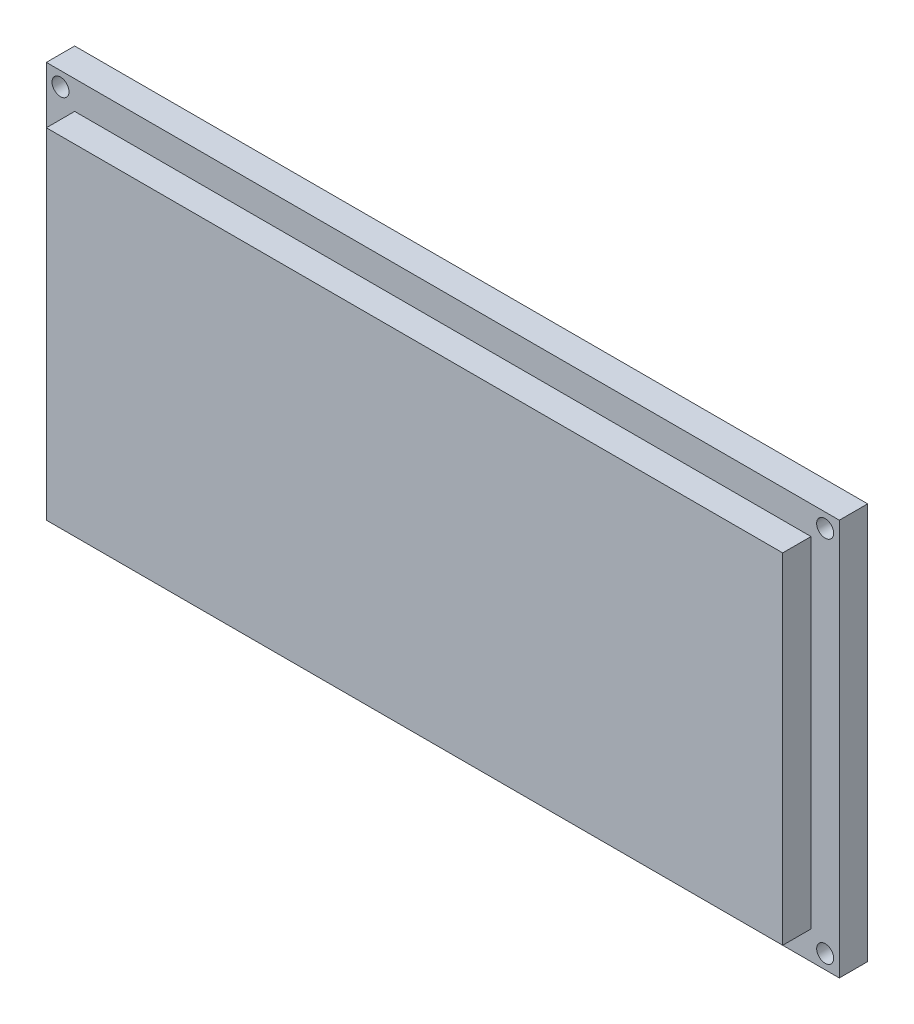
ISO-10303-21;
HEADER;
FILE_DESCRIPTION(('STEP AP214'),'2;1');
FILE_NAME('part.step','',(''),(''),'','','');
FILE_SCHEMA(('AUTOMOTIVE_DESIGN { 1 0 10303 214 1 1 1 1 }'));
ENDSEC;
DATA;
#1=APPLICATION_CONTEXT('core data for automotive mechanical design processes');
#2=APPLICATION_PROTOCOL_DEFINITION('international standard','automotive_design',2000,#1);
#3=PRODUCT_CONTEXT('',#1,'mechanical');
#4=PRODUCT('Part','Part','',(#3));
#5=PRODUCT_RELATED_PRODUCT_CATEGORY('part','',(#4));
#6=PRODUCT_DEFINITION_FORMATION('','',#4);
#7=PRODUCT_DEFINITION_CONTEXT('part definition',#1,'design');
#8=PRODUCT_DEFINITION('design','',#6,#7);
#9=PRODUCT_DEFINITION_SHAPE('','',#8);
#10=(LENGTH_UNIT() NAMED_UNIT(*) SI_UNIT(.MILLI.,.METRE.));
#11=(NAMED_UNIT(*) PLANE_ANGLE_UNIT() SI_UNIT($,.RADIAN.));
#12=(NAMED_UNIT(*) SI_UNIT($,.STERADIAN.) SOLID_ANGLE_UNIT());
#13=UNCERTAINTY_MEASURE_WITH_UNIT(LENGTH_MEASURE(1.E-05),#10,'distance_accuracy_value','');
#14=(GEOMETRIC_REPRESENTATION_CONTEXT(3) GLOBAL_UNCERTAINTY_ASSIGNED_CONTEXT((#13)) GLOBAL_UNIT_ASSIGNED_CONTEXT((#10,
#11,#12)) REPRESENTATION_CONTEXT('',''));
#15=CARTESIAN_POINT('',(0.,0.,0.));
#16=DIRECTION('',(0.,0.,1.));
#17=DIRECTION('',(1.,0.,0.));
#18=AXIS2_PLACEMENT_3D('',#15,#16,#17);
#19=CARTESIAN_POINT('',(0.,0.,5.));
#20=DIRECTION('',(0.,0.,-1.));
#21=DIRECTION('',(-1.,0.,0.));
#22=AXIS2_PLACEMENT_3D('',#19,#20,#21);
#23=PLANE('',#22);
#24=CARTESIAN_POINT('',(137.5,2.5,5.));
#25=DIRECTION('',(0.,0.,-1.));
#26=DIRECTION('',(-1.,0.,0.));
#27=AXIS2_PLACEMENT_3D('',#24,#25,#26);
#28=CIRCLE('',#27,1.5);
#29=CARTESIAN_POINT('',(136.,2.5,5.));
#30=VERTEX_POINT('',#29);
#31=EDGE_CURVE('E311',#30,#30,#28,.T.);
#32=ORIENTED_EDGE('',*,*,#31,.T.);
#33=EDGE_LOOP('',(#32));
#34=FACE_BOUND('',#33,.T.);
#35=CARTESIAN_POINT('',(137.5,67.5,5.));
#36=DIRECTION('',(0.,0.,-1.));
#37=DIRECTION('',(-1.,0.,0.));
#38=AXIS2_PLACEMENT_3D('',#35,#36,#37);
#39=CIRCLE('',#38,1.5);
#40=CARTESIAN_POINT('',(136.,67.5,5.));
#41=VERTEX_POINT('',#40);
#42=EDGE_CURVE('E315',#41,#41,#39,.T.);
#43=ORIENTED_EDGE('',*,*,#42,.T.);
#44=EDGE_LOOP('',(#43));
#45=FACE_BOUND('',#44,.T.);
#46=CARTESIAN_POINT('',(2.5,2.5,5.));
#47=DIRECTION('',(0.,0.,-1.));
#48=DIRECTION('',(-1.,0.,0.));
#49=AXIS2_PLACEMENT_3D('',#46,#47,#48);
#50=CIRCLE('',#49,1.49999999999999);
#51=CARTESIAN_POINT('',(1.00000000000001,2.5,5.));
#52=VERTEX_POINT('',#51);
#53=EDGE_CURVE('E324',#52,#52,#50,.T.);
#54=ORIENTED_EDGE('',*,*,#53,.T.);
#55=EDGE_LOOP('',(#54));
#56=FACE_BOUND('',#55,.T.);
#57=CARTESIAN_POINT('',(2.5,67.5,5.));
#58=DIRECTION('',(0.,0.,-1.));
#59=DIRECTION('',(-1.,0.,0.));
#60=AXIS2_PLACEMENT_3D('',#57,#58,#59);
#61=CIRCLE('',#60,1.49999999999999);
#62=CARTESIAN_POINT('',(1.00000000000001,67.5,5.));
#63=VERTEX_POINT('',#62);
#64=EDGE_CURVE('E39',#63,#63,#61,.T.);
#65=ORIENTED_EDGE('',*,*,#64,.T.);
#66=EDGE_LOOP('',(#65));
#67=FACE_BOUND('',#66,.T.);
#68=DIRECTION('',(0.,-1.,0.));
#69=VECTOR('',#68,1.);
#70=CARTESIAN_POINT('',(0.,0.,5.));
#71=LINE('',#70,#69);
#72=CARTESIAN_POINT('',(0.,70.,5.));
#73=VERTEX_POINT('',#72);
#74=CARTESIAN_POINT('',(0.,0.,5.));
#75=VERTEX_POINT('',#74);
#76=EDGE_CURVE('E131',#73,#75,#71,.T.);
#77=ORIENTED_EDGE('',*,*,#76,.T.);
#78=DIRECTION('',(1.,0.,0.));
#79=VECTOR('',#78,1.);
#80=CARTESIAN_POINT('',(0.,0.,5.));
#81=LINE('',#80,#79);
#82=CARTESIAN_POINT('',(140.,0.,5.));
#83=VERTEX_POINT('',#82);
#84=EDGE_CURVE('E134',#75,#83,#81,.T.);
#85=ORIENTED_EDGE('',*,*,#84,.T.);
#86=DIRECTION('',(0.,1.,0.));
#87=VECTOR('',#86,1.);
#88=CARTESIAN_POINT('',(140.,0.,5.));
#89=LINE('',#88,#87);
#90=CARTESIAN_POINT('',(140.,70.,5.));
#91=VERTEX_POINT('',#90);
#92=EDGE_CURVE('E137',#83,#91,#89,.T.);
#93=ORIENTED_EDGE('',*,*,#92,.T.);
#94=DIRECTION('',(-1.,0.,0.));
#95=VECTOR('',#94,1.);
#96=CARTESIAN_POINT('',(0.,70.,5.));
#97=LINE('',#96,#95);
#98=EDGE_CURVE('E139',#91,#73,#97,.T.);
#99=ORIENTED_EDGE('',*,*,#98,.T.);
#100=EDGE_LOOP('',(#77,#85,#93,#99));
#101=FACE_BOUND('',#100,.T.);
#102=DIRECTION('',(1.,0.,0.));
#103=VECTOR('',#102,1.);
#104=CARTESIAN_POINT('',(0.,5.,5.));
#105=LINE('',#104,#103);
#106=CARTESIAN_POINT('',(5.,5.,5.));
#107=VERTEX_POINT('',#106);
#108=CARTESIAN_POINT('',(135.,5.,5.));
#109=VERTEX_POINT('',#108);
#110=EDGE_CURVE('E51',#107,#109,#105,.T.);
#111=ORIENTED_EDGE('',*,*,#110,.F.);
#112=DIRECTION('',(0.,1.,0.));
#113=VECTOR('',#112,1.);
#114=CARTESIAN_POINT('',(5.,0.,5.));
#115=LINE('',#114,#113);
#116=CARTESIAN_POINT('',(5.,65.,5.));
#117=VERTEX_POINT('',#116);
#118=EDGE_CURVE('E56',#107,#117,#115,.T.);
#119=ORIENTED_EDGE('',*,*,#118,.T.);
#120=DIRECTION('',(1.,0.,0.));
#121=VECTOR('',#120,1.);
#122=CARTESIAN_POINT('',(0.,65.,5.));
#123=LINE('',#122,#121);
#124=CARTESIAN_POINT('',(135.,65.,5.));
#125=VERTEX_POINT('',#124);
#126=EDGE_CURVE('E336',#117,#125,#123,.T.);
#127=ORIENTED_EDGE('',*,*,#126,.T.);
#128=DIRECTION('',(0.,1.,0.));
#129=VECTOR('',#128,1.);
#130=CARTESIAN_POINT('',(135.,0.,5.));
#131=LINE('',#130,#129);
#132=EDGE_CURVE('E334',#109,#125,#131,.T.);
#133=ORIENTED_EDGE('',*,*,#132,.F.);
#134=EDGE_LOOP('',(#111,#119,#127,#133));
#135=FACE_BOUND('',#134,.T.);
#136=ADVANCED_FACE('F35',(#34,#45,#56,#67,#101,#135),#23,.F.);
#137=CARTESIAN_POINT('',(0.,0.,5.));
#138=DIRECTION('',(1.,0.,0.));
#139=DIRECTION('',(0.,0.,-1.));
#140=AXIS2_PLACEMENT_3D('',#137,#138,#139);
#141=PLANE('',#140);
#142=DIRECTION('',(0.,-1.,0.));
#143=VECTOR('',#142,1.);
#144=CARTESIAN_POINT('',(0.,0.,0.));
#145=LINE('',#144,#143);
#146=CARTESIAN_POINT('',(0.,70.,0.));
#147=VERTEX_POINT('',#146);
#148=CARTESIAN_POINT('',(0.,0.,0.));
#149=VERTEX_POINT('',#148);
#150=EDGE_CURVE('E122',#147,#149,#145,.T.);
#151=ORIENTED_EDGE('',*,*,#150,.T.);
#152=DIRECTION('',(0.,0.,-1.));
#153=VECTOR('',#152,1.);
#154=CARTESIAN_POINT('',(0.,0.,5.));
#155=LINE('',#154,#153);
#156=EDGE_CURVE('E11',#75,#149,#155,.T.);
#157=ORIENTED_EDGE('',*,*,#156,.F.);
#158=ORIENTED_EDGE('',*,*,#76,.F.);
#159=DIRECTION('',(0.,0.,-1.));
#160=VECTOR('',#159,1.);
#161=CARTESIAN_POINT('',(0.,70.,5.));
#162=LINE('',#161,#160);
#163=EDGE_CURVE('E140',#73,#147,#162,.T.);
#164=ORIENTED_EDGE('',*,*,#163,.T.);
#165=EDGE_LOOP('',(#151,#157,#158,#164));
#166=FACE_BOUND('',#165,.T.);
#167=ADVANCED_FACE('F37',(#166),#141,.F.);
#168=CARTESIAN_POINT('',(0.,0.,5.));
#169=DIRECTION('',(0.,1.,0.));
#170=DIRECTION('',(0.,0.,1.));
#171=AXIS2_PLACEMENT_3D('',#168,#169,#170);
#172=PLANE('',#171);
#173=DIRECTION('',(1.,0.,0.));
#174=VECTOR('',#173,1.);
#175=CARTESIAN_POINT('',(0.,0.,0.));
#176=LINE('',#175,#174);
#177=CARTESIAN_POINT('',(140.,0.,0.));
#178=VERTEX_POINT('',#177);
#179=EDGE_CURVE('E125',#149,#178,#176,.T.);
#180=ORIENTED_EDGE('',*,*,#179,.T.);
#181=DIRECTION('',(0.,0.,-1.));
#182=VECTOR('',#181,1.);
#183=CARTESIAN_POINT('',(140.,0.,5.));
#184=LINE('',#183,#182);
#185=EDGE_CURVE('E44',#83,#178,#184,.T.);
#186=ORIENTED_EDGE('',*,*,#185,.F.);
#187=ORIENTED_EDGE('',*,*,#84,.F.);
#188=ORIENTED_EDGE('',*,*,#156,.T.);
#189=EDGE_LOOP('',(#180,#186,#187,#188));
#190=FACE_BOUND('',#189,.T.);
#191=ADVANCED_FACE('F171',(#190),#172,.F.);
#192=CARTESIAN_POINT('',(140.,0.,5.));
#193=DIRECTION('',(-1.,0.,0.));
#194=DIRECTION('',(0.,0.,1.));
#195=AXIS2_PLACEMENT_3D('',#192,#193,#194);
#196=PLANE('',#195);
#197=DIRECTION('',(0.,1.,0.));
#198=VECTOR('',#197,1.);
#199=CARTESIAN_POINT('',(140.,0.,0.));
#200=LINE('',#199,#198);
#201=CARTESIAN_POINT('',(140.,70.,0.));
#202=VERTEX_POINT('',#201);
#203=EDGE_CURVE('E143',#178,#202,#200,.T.);
#204=ORIENTED_EDGE('',*,*,#203,.T.);
#205=DIRECTION('',(0.,0.,-1.));
#206=VECTOR('',#205,1.);
#207=CARTESIAN_POINT('',(140.,70.,5.));
#208=LINE('',#207,#206);
#209=EDGE_CURVE('E148',#91,#202,#208,.T.);
#210=ORIENTED_EDGE('',*,*,#209,.F.);
#211=ORIENTED_EDGE('',*,*,#92,.F.);
#212=ORIENTED_EDGE('',*,*,#185,.T.);
#213=EDGE_LOOP('',(#204,#210,#211,#212));
#214=FACE_BOUND('',#213,.T.);
#215=ADVANCED_FACE('F156',(#214),#196,.F.);
#216=CARTESIAN_POINT('',(0.,70.,5.));
#217=DIRECTION('',(0.,-1.,0.));
#218=DIRECTION('',(0.,0.,-1.));
#219=AXIS2_PLACEMENT_3D('',#216,#217,#218);
#220=PLANE('',#219);
#221=DIRECTION('',(-1.,0.,0.));
#222=VECTOR('',#221,1.);
#223=CARTESIAN_POINT('',(0.,70.,0.));
#224=LINE('',#223,#222);
#225=EDGE_CURVE('E135',#202,#147,#224,.T.);
#226=ORIENTED_EDGE('',*,*,#225,.T.);
#227=ORIENTED_EDGE('',*,*,#163,.F.);
#228=ORIENTED_EDGE('',*,*,#98,.F.);
#229=ORIENTED_EDGE('',*,*,#209,.T.);
#230=EDGE_LOOP('',(#226,#227,#228,#229));
#231=FACE_BOUND('',#230,.T.);
#232=ADVANCED_FACE('F165',(#231),#220,.F.);
#233=CARTESIAN_POINT('',(0.,0.,0.));
#234=DIRECTION('',(0.,0.,-1.));
#235=DIRECTION('',(-1.,0.,0.));
#236=AXIS2_PLACEMENT_3D('',#233,#234,#235);
#237=PLANE('',#236);
#238=CARTESIAN_POINT('',(137.5,2.5,0.));
#239=DIRECTION('',(0.,0.,-1.));
#240=DIRECTION('',(-1.,0.,0.));
#241=AXIS2_PLACEMENT_3D('',#238,#239,#240);
#242=CIRCLE('',#241,1.5);
#243=CARTESIAN_POINT('',(136.,2.5,0.));
#244=VERTEX_POINT('',#243);
#245=EDGE_CURVE('E309',#244,#244,#242,.T.);
#246=ORIENTED_EDGE('',*,*,#245,.F.);
#247=EDGE_LOOP('',(#246));
#248=FACE_BOUND('',#247,.T.);
#249=CARTESIAN_POINT('',(137.5,67.5,0.));
#250=DIRECTION('',(0.,0.,-1.));
#251=DIRECTION('',(-1.,0.,0.));
#252=AXIS2_PLACEMENT_3D('',#249,#250,#251);
#253=CIRCLE('',#252,1.5);
#254=CARTESIAN_POINT('',(136.,67.5,0.));
#255=VERTEX_POINT('',#254);
#256=EDGE_CURVE('E312',#255,#255,#253,.T.);
#257=ORIENTED_EDGE('',*,*,#256,.F.);
#258=EDGE_LOOP('',(#257));
#259=FACE_BOUND('',#258,.T.);
#260=CARTESIAN_POINT('',(2.5,2.5,0.));
#261=DIRECTION('',(0.,0.,-1.));
#262=DIRECTION('',(-1.,0.,0.));
#263=AXIS2_PLACEMENT_3D('',#260,#261,#262);
#264=CIRCLE('',#263,1.49999999999999);
#265=CARTESIAN_POINT('',(1.00000000000001,2.5,0.));
#266=VERTEX_POINT('',#265);
#267=EDGE_CURVE('E321',#266,#266,#264,.T.);
#268=ORIENTED_EDGE('',*,*,#267,.F.);
#269=EDGE_LOOP('',(#268));
#270=FACE_BOUND('',#269,.T.);
#271=CARTESIAN_POINT('',(2.5,67.5,0.));
#272=DIRECTION('',(0.,0.,-1.));
#273=DIRECTION('',(-1.,0.,0.));
#274=AXIS2_PLACEMENT_3D('',#271,#272,#273);
#275=CIRCLE('',#274,1.49999999999999);
#276=CARTESIAN_POINT('',(1.00000000000001,67.5,0.));
#277=VERTEX_POINT('',#276);
#278=EDGE_CURVE('E327',#277,#277,#275,.T.);
#279=ORIENTED_EDGE('',*,*,#278,.F.);
#280=EDGE_LOOP('',(#279));
#281=FACE_BOUND('',#280,.T.);
#282=ORIENTED_EDGE('',*,*,#150,.F.);
#283=ORIENTED_EDGE('',*,*,#225,.F.);
#284=ORIENTED_EDGE('',*,*,#203,.F.);
#285=ORIENTED_EDGE('',*,*,#179,.F.);
#286=EDGE_LOOP('',(#282,#283,#284,#285));
#287=FACE_BOUND('',#286,.T.);
#288=ADVANCED_FACE('F162',(#248,#259,#270,#281,#287),#237,.T.);
#289=CARTESIAN_POINT('',(0.,5.,10.));
#290=DIRECTION('',(0.,1.,0.));
#291=DIRECTION('',(0.,0.,1.));
#292=AXIS2_PLACEMENT_3D('',#289,#290,#291);
#293=PLANE('',#292);
#294=ORIENTED_EDGE('',*,*,#110,.T.);
#295=DIRECTION('',(0.,0.,-1.));
#296=VECTOR('',#295,1.);
#297=CARTESIAN_POINT('',(135.,5.,10.));
#298=LINE('',#297,#296);
#299=CARTESIAN_POINT('',(135.,5.,10.));
#300=VERTEX_POINT('',#299);
#301=EDGE_CURVE('E105',#300,#109,#298,.T.);
#302=ORIENTED_EDGE('',*,*,#301,.F.);
#303=DIRECTION('',(1.,0.,0.));
#304=VECTOR('',#303,1.);
#305=CARTESIAN_POINT('',(0.,5.,10.));
#306=LINE('',#305,#304);
#307=CARTESIAN_POINT('',(5.,5.,10.));
#308=VERTEX_POINT('',#307);
#309=EDGE_CURVE('E112',#308,#300,#306,.T.);
#310=ORIENTED_EDGE('',*,*,#309,.F.);
#311=DIRECTION('',(0.,0.,-1.));
#312=VECTOR('',#311,1.);
#313=CARTESIAN_POINT('',(5.,5.,10.));
#314=LINE('',#313,#312);
#315=EDGE_CURVE('E332',#308,#107,#314,.T.);
#316=ORIENTED_EDGE('',*,*,#315,.T.);
#317=EDGE_LOOP('',(#294,#302,#310,#316));
#318=FACE_BOUND('',#317,.T.);
#319=ADVANCED_FACE('F121',(#318),#293,.F.);
#320=CARTESIAN_POINT('',(135.,0.,10.));
#321=DIRECTION('',(-1.,0.,0.));
#322=DIRECTION('',(0.,0.,1.));
#323=AXIS2_PLACEMENT_3D('',#320,#321,#322);
#324=PLANE('',#323);
#325=ORIENTED_EDGE('',*,*,#132,.T.);
#326=DIRECTION('',(0.,0.,-1.));
#327=VECTOR('',#326,1.);
#328=CARTESIAN_POINT('',(135.,65.,10.));
#329=LINE('',#328,#327);
#330=CARTESIAN_POINT('',(135.,65.,10.));
#331=VERTEX_POINT('',#330);
#332=EDGE_CURVE('E107',#331,#125,#329,.T.);
#333=ORIENTED_EDGE('',*,*,#332,.F.);
#334=DIRECTION('',(0.,1.,0.));
#335=VECTOR('',#334,1.);
#336=CARTESIAN_POINT('',(135.,0.,10.));
#337=LINE('',#336,#335);
#338=EDGE_CURVE('E100',#300,#331,#337,.T.);
#339=ORIENTED_EDGE('',*,*,#338,.F.);
#340=ORIENTED_EDGE('',*,*,#301,.T.);
#341=EDGE_LOOP('',(#325,#333,#339,#340));
#342=FACE_BOUND('',#341,.T.);
#343=ADVANCED_FACE('F103',(#342),#324,.F.);
#344=CARTESIAN_POINT('',(0.,65.,10.));
#345=DIRECTION('',(0.,1.,0.));
#346=DIRECTION('',(0.,0.,1.));
#347=AXIS2_PLACEMENT_3D('',#344,#345,#346);
#348=PLANE('',#347);
#349=ORIENTED_EDGE('',*,*,#126,.F.);
#350=DIRECTION('',(0.,0.,-1.));
#351=VECTOR('',#350,1.);
#352=CARTESIAN_POINT('',(5.,65.,10.));
#353=LINE('',#352,#351);
#354=CARTESIAN_POINT('',(5.,65.,10.));
#355=VERTEX_POINT('',#354);
#356=EDGE_CURVE('E127',#355,#117,#353,.T.);
#357=ORIENTED_EDGE('',*,*,#356,.F.);
#358=DIRECTION('',(1.,0.,0.));
#359=VECTOR('',#358,1.);
#360=CARTESIAN_POINT('',(0.,65.,10.));
#361=LINE('',#360,#359);
#362=EDGE_CURVE('E111',#355,#331,#361,.T.);
#363=ORIENTED_EDGE('',*,*,#362,.T.);
#364=ORIENTED_EDGE('',*,*,#332,.T.);
#365=EDGE_LOOP('',(#349,#357,#363,#364));
#366=FACE_BOUND('',#365,.T.);
#367=ADVANCED_FACE('F212',(#366),#348,.T.);
#368=CARTESIAN_POINT('',(5.,0.,10.));
#369=DIRECTION('',(-1.,0.,0.));
#370=DIRECTION('',(0.,0.,1.));
#371=AXIS2_PLACEMENT_3D('',#368,#369,#370);
#372=PLANE('',#371);
#373=ORIENTED_EDGE('',*,*,#118,.F.);
#374=ORIENTED_EDGE('',*,*,#315,.F.);
#375=DIRECTION('',(0.,1.,0.));
#376=VECTOR('',#375,1.);
#377=CARTESIAN_POINT('',(5.,0.,10.));
#378=LINE('',#377,#376);
#379=EDGE_CURVE('E118',#308,#355,#378,.T.);
#380=ORIENTED_EDGE('',*,*,#379,.T.);
#381=ORIENTED_EDGE('',*,*,#356,.T.);
#382=EDGE_LOOP('',(#373,#374,#380,#381));
#383=FACE_BOUND('',#382,.T.);
#384=ADVANCED_FACE('F218',(#383),#372,.T.);
#385=CARTESIAN_POINT('',(0.,0.,10.));
#386=DIRECTION('',(0.,0.,1.));
#387=DIRECTION('',(1.,0.,0.));
#388=AXIS2_PLACEMENT_3D('',#385,#386,#387);
#389=PLANE('',#388);
#390=ORIENTED_EDGE('',*,*,#309,.T.);
#391=ORIENTED_EDGE('',*,*,#338,.T.);
#392=ORIENTED_EDGE('',*,*,#362,.F.);
#393=ORIENTED_EDGE('',*,*,#379,.F.);
#394=EDGE_LOOP('',(#390,#391,#392,#393));
#395=FACE_BOUND('',#394,.T.);
#396=ADVANCED_FACE('F116',(#395),#389,.T.);
#397=CARTESIAN_POINT('',(2.5,67.5,0.));
#398=DIRECTION('',(0.,0.,-1.));
#399=DIRECTION('',(-1.,0.,0.));
#400=AXIS2_PLACEMENT_3D('',#397,#398,#399);
#401=CYLINDRICAL_SURFACE('',#400,1.49999999999999);
#402=ORIENTED_EDGE('',*,*,#278,.T.);
#403=EDGE_LOOP('',(#402));
#404=FACE_BOUND('',#403,.T.);
#405=ORIENTED_EDGE('',*,*,#64,.F.);
#406=EDGE_LOOP('',(#405));
#407=FACE_BOUND('',#406,.T.);
#408=ADVANCED_FACE('F233',(#404,#407),#401,.F.);
#409=CARTESIAN_POINT('',(2.5,2.5,0.));
#410=DIRECTION('',(0.,0.,-1.));
#411=DIRECTION('',(-1.,0.,0.));
#412=AXIS2_PLACEMENT_3D('',#409,#410,#411);
#413=CYLINDRICAL_SURFACE('',#412,1.49999999999999);
#414=ORIENTED_EDGE('',*,*,#267,.T.);
#415=EDGE_LOOP('',(#414));
#416=FACE_BOUND('',#415,.T.);
#417=ORIENTED_EDGE('',*,*,#53,.F.);
#418=EDGE_LOOP('',(#417));
#419=FACE_BOUND('',#418,.T.);
#420=ADVANCED_FACE('F239',(#416,#419),#413,.F.);
#421=CARTESIAN_POINT('',(137.5,67.5,0.));
#422=DIRECTION('',(0.,0.,-1.));
#423=DIRECTION('',(-1.,0.,0.));
#424=AXIS2_PLACEMENT_3D('',#421,#422,#423);
#425=CYLINDRICAL_SURFACE('',#424,1.5);
#426=ORIENTED_EDGE('',*,*,#256,.T.);
#427=EDGE_LOOP('',(#426));
#428=FACE_BOUND('',#427,.T.);
#429=ORIENTED_EDGE('',*,*,#42,.F.);
#430=EDGE_LOOP('',(#429));
#431=FACE_BOUND('',#430,.T.);
#432=ADVANCED_FACE('F247',(#428,#431),#425,.F.);
#433=CARTESIAN_POINT('',(137.5,2.5,0.));
#434=DIRECTION('',(0.,0.,-1.));
#435=DIRECTION('',(-1.,0.,0.));
#436=AXIS2_PLACEMENT_3D('',#433,#434,#435);
#437=CYLINDRICAL_SURFACE('',#436,1.5);
#438=ORIENTED_EDGE('',*,*,#245,.T.);
#439=EDGE_LOOP('',(#438));
#440=FACE_BOUND('',#439,.T.);
#441=ORIENTED_EDGE('',*,*,#31,.F.);
#442=EDGE_LOOP('',(#441));
#443=FACE_BOUND('',#442,.T.);
#444=ADVANCED_FACE('F255',(#440,#443),#437,.F.);
#445=CLOSED_SHELL('',(#136,#167,#191,#215,#232,#288,#319,#343,#367,#384,#396,#408,#420,#432,#444));
#446=MANIFOLD_SOLID_BREP('B2',#445);
#447=ADVANCED_BREP_SHAPE_REPRESENTATION('',(#18,#446),#14);
#448=SHAPE_DEFINITION_REPRESENTATION(#9,#447);
ENDSEC;
END-ISO-10303-21;
